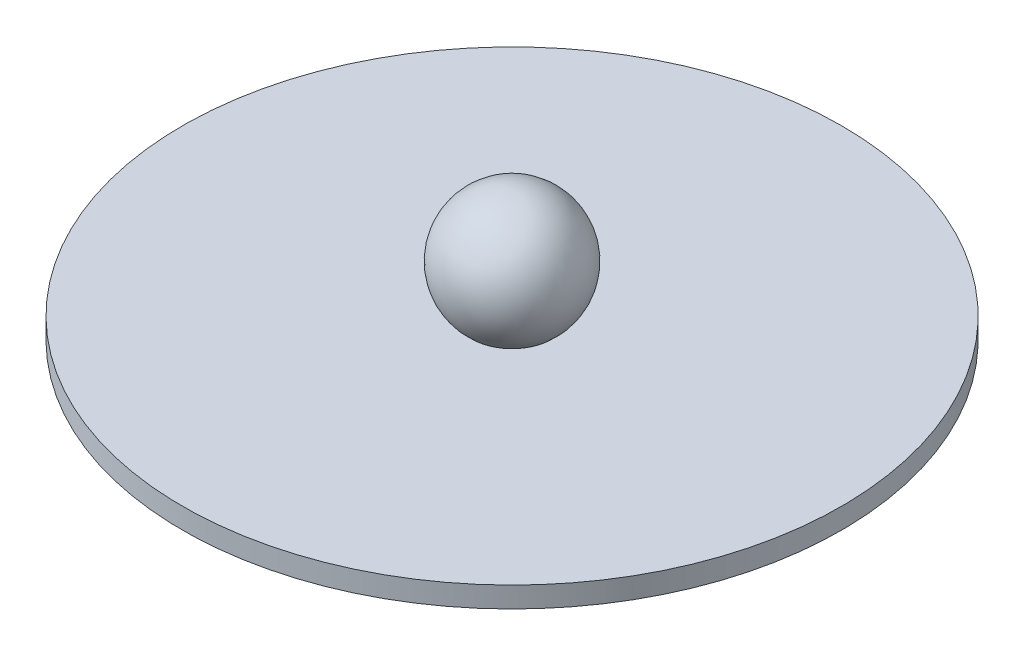
ISO-10303-21;
HEADER;
FILE_DESCRIPTION(('STEP AP214'),'2;1');
FILE_NAME('part.step','',(''),(''),'','','');
FILE_SCHEMA(('AUTOMOTIVE_DESIGN { 1 0 10303 214 1 1 1 1 }'));
ENDSEC;
DATA;
#1=APPLICATION_CONTEXT('core data for automotive mechanical design processes');
#2=APPLICATION_PROTOCOL_DEFINITION('international standard','automotive_design',2000,#1);
#3=PRODUCT_CONTEXT('',#1,'mechanical');
#4=PRODUCT('Part','Part','',(#3));
#5=PRODUCT_RELATED_PRODUCT_CATEGORY('part','',(#4));
#6=PRODUCT_DEFINITION_FORMATION('','',#4);
#7=PRODUCT_DEFINITION_CONTEXT('part definition',#1,'design');
#8=PRODUCT_DEFINITION('design','',#6,#7);
#9=PRODUCT_DEFINITION_SHAPE('','',#8);
#10=(LENGTH_UNIT() NAMED_UNIT(*) SI_UNIT(.MILLI.,.METRE.));
#11=(NAMED_UNIT(*) PLANE_ANGLE_UNIT() SI_UNIT($,.RADIAN.));
#12=(NAMED_UNIT(*) SI_UNIT($,.STERADIAN.) SOLID_ANGLE_UNIT());
#13=UNCERTAINTY_MEASURE_WITH_UNIT(LENGTH_MEASURE(1.E-05),#10,'distance_accuracy_value','');
#14=(GEOMETRIC_REPRESENTATION_CONTEXT(3) GLOBAL_UNCERTAINTY_ASSIGNED_CONTEXT((#13)) GLOBAL_UNIT_ASSIGNED_CONTEXT((#10,
#11,#12)) REPRESENTATION_CONTEXT('',''));
#15=CARTESIAN_POINT('',(0.,0.,0.));
#16=DIRECTION('',(0.,0.,1.));
#17=DIRECTION('',(1.,0.,0.));
#18=AXIS2_PLACEMENT_3D('',#15,#16,#17);
#19=CARTESIAN_POINT('',(0.,12.7,0.));
#20=DIRECTION('',(0.,1.,0.));
#21=DIRECTION('',(0.,0.,1.));
#22=AXIS2_PLACEMENT_3D('',#19,#20,#21);
#23=PLANE('',#22);
#24=CARTESIAN_POINT('',(0.,12.7,0.));
#25=DIRECTION('',(0.,1.,0.));
#26=DIRECTION('',(0.,0.,1.));
#27=AXIS2_PLACEMENT_3D('',#24,#25,#26);
#28=CIRCLE('',#27,12.2794054520389);
#29=CARTESIAN_POINT('',(0.,12.7,12.2794054520389));
#30=VERTEX_POINT('',#29);
#31=EDGE_CURVE('E10',#30,#30,#28,.T.);
#32=ORIENTED_EDGE('',*,*,#31,.F.);
#33=EDGE_LOOP('',(#32));
#34=FACE_BOUND('',#33,.T.);
#35=CARTESIAN_POINT('',(0.,12.7,0.));
#36=DIRECTION('',(0.,-1.,0.));
#37=DIRECTION('',(0.,0.,-1.));
#38=AXIS2_PLACEMENT_3D('',#35,#36,#37);
#39=CIRCLE('',#38,100.965);
#40=CARTESIAN_POINT('',(0.,12.7,-100.965));
#41=VERTEX_POINT('',#40);
#42=EDGE_CURVE('E39',#41,#41,#39,.T.);
#43=ORIENTED_EDGE('',*,*,#42,.F.);
#44=EDGE_LOOP('',(#43));
#45=FACE_BOUND('',#44,.T.);
#46=ADVANCED_FACE('F33',(#34,#45),#23,.T.);
#47=CARTESIAN_POINT('',(0.,0.,0.));
#48=DIRECTION('',(0.,-1.,0.));
#49=DIRECTION('',(0.,0.,-1.));
#50=AXIS2_PLACEMENT_3D('',#47,#48,#49);
#51=CYLINDRICAL_SURFACE('',#50,100.965);
#52=ORIENTED_EDGE('',*,*,#42,.T.);
#53=EDGE_LOOP('',(#52));
#54=FACE_BOUND('',#53,.T.);
#55=CARTESIAN_POINT('',(0.,6.34999999999999,0.));
#56=DIRECTION('',(0.,-1.,0.));
#57=DIRECTION('',(0.,0.,-1.));
#58=AXIS2_PLACEMENT_3D('',#55,#56,#57);
#59=CIRCLE('',#58,100.965);
#60=CARTESIAN_POINT('',(0.,6.34999999999999,-100.965));
#61=VERTEX_POINT('',#60);
#62=EDGE_CURVE('E43',#61,#61,#59,.T.);
#63=ORIENTED_EDGE('',*,*,#62,.F.);
#64=EDGE_LOOP('',(#63));
#65=FACE_BOUND('',#64,.T.);
#66=ADVANCED_FACE('F69',(#54,#65),#51,.T.);
#67=CARTESIAN_POINT('',(100.965,6.34999999999999,0.));
#68=DIRECTION('',(0.,-1.,0.));
#69=DIRECTION('',(0.,0.,-1.));
#70=AXIS2_PLACEMENT_3D('',#67,#68,#69);
#71=PLANE('',#70);
#72=ORIENTED_EDGE('',*,*,#62,.T.);
#73=EDGE_LOOP('',(#72));
#74=FACE_BOUND('',#73,.T.);
#75=CARTESIAN_POINT('',(0.,6.34999999999999,0.));
#76=DIRECTION('',(0.,-1.,0.));
#77=DIRECTION('',(0.,0.,-1.));
#78=AXIS2_PLACEMENT_3D('',#75,#76,#77);
#79=CIRCLE('',#78,95.885);
#80=CARTESIAN_POINT('',(0.,6.34999999999999,-95.885));
#81=VERTEX_POINT('',#80);
#82=EDGE_CURVE('E47',#81,#81,#79,.T.);
#83=ORIENTED_EDGE('',*,*,#82,.F.);
#84=EDGE_LOOP('',(#83));
#85=FACE_BOUND('',#84,.T.);
#86=ADVANCED_FACE('F60',(#74,#85),#71,.T.);
#87=CARTESIAN_POINT('',(0.,0.,0.));
#88=DIRECTION('',(0.,1.,0.));
#89=DIRECTION('',(0.,0.,1.));
#90=AXIS2_PLACEMENT_3D('',#87,#88,#89);
#91=CONICAL_SURFACE('',#90,89.5350000000001,0.785398163397443);
#92=ORIENTED_EDGE('',*,*,#82,.T.);
#93=EDGE_LOOP('',(#92));
#94=FACE_BOUND('',#93,.T.);
#95=CARTESIAN_POINT('',(0.,0.,0.));
#96=DIRECTION('',(0.,-1.,0.));
#97=DIRECTION('',(0.,0.,-1.));
#98=AXIS2_PLACEMENT_3D('',#95,#96,#97);
#99=CIRCLE('',#98,89.5350000000001);
#100=CARTESIAN_POINT('',(0.,0.,-89.5350000000001));
#101=VERTEX_POINT('',#100);
#102=EDGE_CURVE('E52',#101,#101,#99,.T.);
#103=ORIENTED_EDGE('',*,*,#102,.F.);
#104=EDGE_LOOP('',(#103));
#105=FACE_BOUND('',#104,.T.);
#106=ADVANCED_FACE('F58',(#94,#105),#91,.T.);
#107=CARTESIAN_POINT('',(89.5350000000001,0.,0.));
#108=DIRECTION('',(0.,-1.,0.));
#109=DIRECTION('',(0.,0.,-1.));
#110=AXIS2_PLACEMENT_3D('',#107,#108,#109);
#111=PLANE('',#110);
#112=ORIENTED_EDGE('',*,*,#102,.T.);
#113=EDGE_LOOP('',(#112));
#114=FACE_BOUND('',#113,.T.);
#115=ADVANCED_FACE('F56',(#114),#111,.T.);
#116=CARTESIAN_POINT('',(0.,27.264295442775,0.));
#117=DIRECTION('',(0.,-1.,0.));
#118=DIRECTION('',(-1.,0.,0.));
#119=AXIS2_PLACEMENT_3D('',#116,#117,#118);
#120=SPHERICAL_SURFACE('',#119,19.05);
#121=ORIENTED_EDGE('',*,*,#31,.T.);
#122=EDGE_LOOP('',(#121));
#123=FACE_BOUND('',#122,.T.);
#124=ADVANCED_FACE('F67',(#123),#120,.T.);
#125=CLOSED_SHELL('',(#46,#66,#86,#106,#115,#124));
#126=MANIFOLD_SOLID_BREP('B2',#125);
#127=ADVANCED_BREP_SHAPE_REPRESENTATION('',(#18,#126),#14);
#128=SHAPE_DEFINITION_REPRESENTATION(#9,#127);
ENDSEC;
END-ISO-10303-21;
